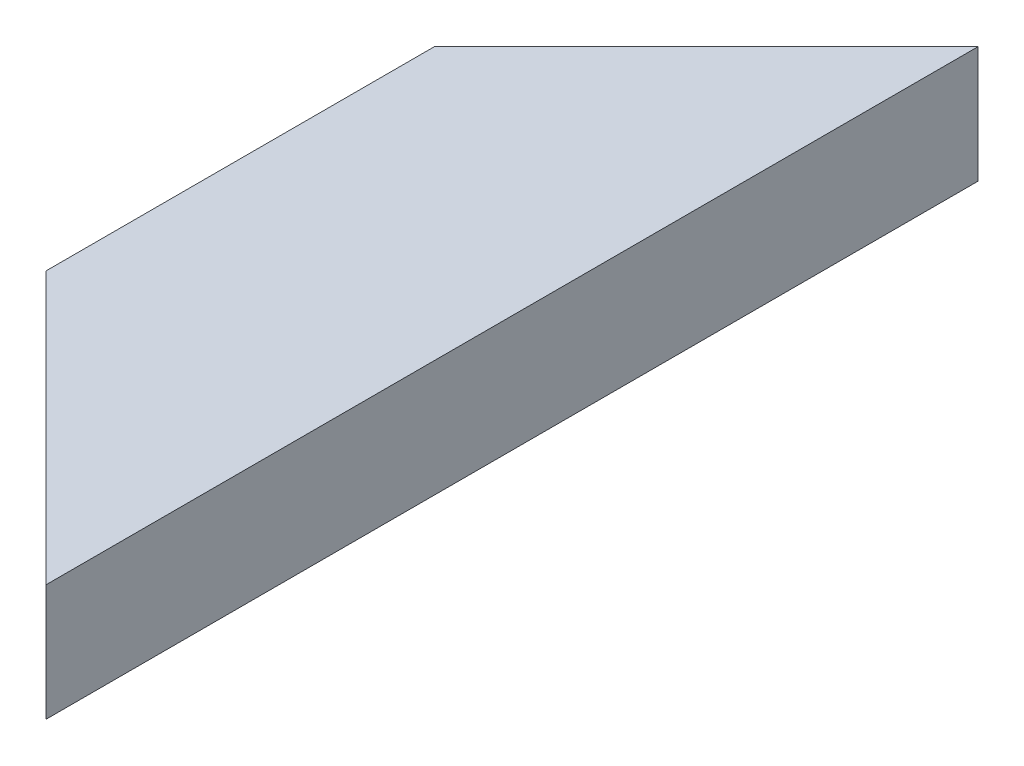
ISO-10303-21;
HEADER;
FILE_DESCRIPTION(('STEP AP214'),'2;1');
FILE_NAME('part.step','',(''),(''),'','','');
FILE_SCHEMA(('AUTOMOTIVE_DESIGN { 1 0 10303 214 1 1 1 1 }'));
ENDSEC;
DATA;
#1=APPLICATION_CONTEXT('core data for automotive mechanical design processes');
#2=APPLICATION_PROTOCOL_DEFINITION('international standard','automotive_design',2000,#1);
#3=PRODUCT_CONTEXT('',#1,'mechanical');
#4=PRODUCT('Part','Part','',(#3));
#5=PRODUCT_RELATED_PRODUCT_CATEGORY('part','',(#4));
#6=PRODUCT_DEFINITION_FORMATION('','',#4);
#7=PRODUCT_DEFINITION_CONTEXT('part definition',#1,'design');
#8=PRODUCT_DEFINITION('design','',#6,#7);
#9=PRODUCT_DEFINITION_SHAPE('','',#8);
#10=(LENGTH_UNIT() NAMED_UNIT(*) SI_UNIT(.MILLI.,.METRE.));
#11=(NAMED_UNIT(*) PLANE_ANGLE_UNIT() SI_UNIT($,.RADIAN.));
#12=(NAMED_UNIT(*) SI_UNIT($,.STERADIAN.) SOLID_ANGLE_UNIT());
#13=UNCERTAINTY_MEASURE_WITH_UNIT(LENGTH_MEASURE(1.E-05),#10,'distance_accuracy_value','');
#14=(GEOMETRIC_REPRESENTATION_CONTEXT(3) GLOBAL_UNCERTAINTY_ASSIGNED_CONTEXT((#13)) GLOBAL_UNIT_ASSIGNED_CONTEXT((#10,
#11,#12)) REPRESENTATION_CONTEXT('',''));
#15=CARTESIAN_POINT('',(0.,0.,0.));
#16=DIRECTION('',(0.,0.,1.));
#17=DIRECTION('',(1.,0.,0.));
#18=AXIS2_PLACEMENT_3D('',#15,#16,#17);
#19=CARTESIAN_POINT('',(-44.45,-19.05,304.8));
#20=DIRECTION('',(1.,0.,0.));
#21=DIRECTION('',(0.,0.,-1.));
#22=AXIS2_PLACEMENT_3D('',#19,#20,#21);
#23=PLANE('',#22);
#24=DIRECTION('',(0.,1.,0.));
#25=VECTOR('',#24,1.);
#26=CARTESIAN_POINT('',(-44.45,-19.05,215.9));
#27=LINE('',#26,#25);
#28=CARTESIAN_POINT('',(-44.45,-19.05,215.9));
#29=VERTEX_POINT('',#28);
#30=CARTESIAN_POINT('',(-44.45,19.05,215.9));
#31=VERTEX_POINT('',#30);
#32=EDGE_CURVE('E74',#29,#31,#27,.T.);
#33=ORIENTED_EDGE('',*,*,#32,.T.);
#34=DIRECTION('',(0.,0.,-1.));
#35=VECTOR('',#34,1.);
#36=CARTESIAN_POINT('',(-44.45,19.05,304.8));
#37=LINE('',#36,#35);
#38=CARTESIAN_POINT('',(-44.45,19.05,88.9));
#39=VERTEX_POINT('',#38);
#40=EDGE_CURVE('E94',#31,#39,#37,.T.);
#41=ORIENTED_EDGE('',*,*,#40,.T.);
#42=DIRECTION('',(0.,1.,0.));
#43=VECTOR('',#42,1.);
#44=CARTESIAN_POINT('',(-44.45,-19.05,88.9));
#45=LINE('',#44,#43);
#46=CARTESIAN_POINT('',(-44.45,-19.05,88.9));
#47=VERTEX_POINT('',#46);
#48=EDGE_CURVE('E93',#47,#39,#45,.T.);
#49=ORIENTED_EDGE('',*,*,#48,.F.);
#50=DIRECTION('',(0.,0.,-1.));
#51=VECTOR('',#50,1.);
#52=CARTESIAN_POINT('',(-44.45,-19.05,304.8));
#53=LINE('',#52,#51);
#54=EDGE_CURVE('E11',#29,#47,#53,.T.);
#55=ORIENTED_EDGE('',*,*,#54,.F.);
#56=EDGE_LOOP('',(#33,#41,#49,#55));
#57=FACE_BOUND('',#56,.T.);
#58=ADVANCED_FACE('F39',(#57),#23,.F.);
#59=CARTESIAN_POINT('',(44.45,-19.05,304.8));
#60=DIRECTION('',(0.,1.,0.));
#61=DIRECTION('',(-1.,0.,0.));
#62=AXIS2_PLACEMENT_3D('',#59,#60,#61);
#63=PLANE('',#62);
#64=DIRECTION('',(0.707106781186548,0.,0.707106781186548));
#65=VECTOR('',#64,1.);
#66=CARTESIAN_POINT('',(-130.175,-19.05,130.175));
#67=LINE('',#66,#65);
#68=CARTESIAN_POINT('',(44.45,-19.05,304.8));
#69=VERTEX_POINT('',#68);
#70=EDGE_CURVE('E54',#29,#69,#67,.T.);
#71=ORIENTED_EDGE('',*,*,#70,.F.);
#72=ORIENTED_EDGE('',*,*,#54,.T.);
#73=DIRECTION('',(0.707106781186547,0.,-0.707106781186548));
#74=VECTOR('',#73,1.);
#75=CARTESIAN_POINT('',(22.225,-19.05,22.225));
#76=LINE('',#75,#74);
#77=CARTESIAN_POINT('',(44.45,-19.05,1.11022302462516E-13));
#78=VERTEX_POINT('',#77);
#79=EDGE_CURVE('E98',#47,#78,#76,.T.);
#80=ORIENTED_EDGE('',*,*,#79,.T.);
#81=DIRECTION('',(0.,0.,-1.));
#82=VECTOR('',#81,1.);
#83=CARTESIAN_POINT('',(44.45,-19.05,304.8));
#84=LINE('',#83,#82);
#85=EDGE_CURVE('E48',#69,#78,#84,.T.);
#86=ORIENTED_EDGE('',*,*,#85,.F.);
#87=EDGE_LOOP('',(#71,#72,#80,#86));
#88=FACE_BOUND('',#87,.T.);
#89=ADVANCED_FACE('F86',(#88),#63,.F.);
#90=CARTESIAN_POINT('',(44.45,19.05,304.8));
#91=DIRECTION('',(0.,-1.,0.));
#92=DIRECTION('',(1.,0.,0.));
#93=AXIS2_PLACEMENT_3D('',#90,#91,#92);
#94=PLANE('',#93);
#95=DIRECTION('',(0.707106781186548,0.,0.707106781186548));
#96=VECTOR('',#95,1.);
#97=CARTESIAN_POINT('',(-130.175,19.05,130.175));
#98=LINE('',#97,#96);
#99=CARTESIAN_POINT('',(44.45,19.05,304.8));
#100=VERTEX_POINT('',#99);
#101=EDGE_CURVE('E77',#31,#100,#98,.T.);
#102=ORIENTED_EDGE('',*,*,#101,.T.);
#103=DIRECTION('',(0.,0.,-1.));
#104=VECTOR('',#103,1.);
#105=CARTESIAN_POINT('',(44.45,19.05,304.8));
#106=LINE('',#105,#104);
#107=CARTESIAN_POINT('',(44.45,19.05,0.));
#108=VERTEX_POINT('',#107);
#109=EDGE_CURVE('E115',#100,#108,#106,.T.);
#110=ORIENTED_EDGE('',*,*,#109,.T.);
#111=DIRECTION('',(0.707106781186547,0.,-0.707106781186548));
#112=VECTOR('',#111,1.);
#113=CARTESIAN_POINT('',(22.225,19.05,22.225));
#114=LINE('',#113,#112);
#115=EDGE_CURVE('E103',#39,#108,#114,.T.);
#116=ORIENTED_EDGE('',*,*,#115,.F.);
#117=ORIENTED_EDGE('',*,*,#40,.F.);
#118=EDGE_LOOP('',(#102,#110,#116,#117));
#119=FACE_BOUND('',#118,.T.);
#120=ADVANCED_FACE('F123',(#119),#94,.F.);
#121=CARTESIAN_POINT('',(44.45,-19.05,304.8));
#122=DIRECTION('',(-1.,0.,0.));
#123=DIRECTION('',(0.,0.,1.));
#124=AXIS2_PLACEMENT_3D('',#121,#122,#123);
#125=PLANE('',#124);
#126=DIRECTION('',(0.,1.,0.));
#127=VECTOR('',#126,1.);
#128=CARTESIAN_POINT('',(44.45,-19.05,0.));
#129=LINE('',#128,#127);
#130=EDGE_CURVE('E83',#78,#108,#129,.T.);
#131=ORIENTED_EDGE('',*,*,#130,.T.);
#132=ORIENTED_EDGE('',*,*,#109,.F.);
#133=DIRECTION('',(0.,1.,0.));
#134=VECTOR('',#133,1.);
#135=CARTESIAN_POINT('',(44.45,-19.05,304.8));
#136=LINE('',#135,#134);
#137=EDGE_CURVE('E107',#69,#100,#136,.T.);
#138=ORIENTED_EDGE('',*,*,#137,.F.);
#139=ORIENTED_EDGE('',*,*,#85,.T.);
#140=EDGE_LOOP('',(#131,#132,#138,#139));
#141=FACE_BOUND('',#140,.T.);
#142=ADVANCED_FACE('F120',(#141),#125,.F.);
#143=CARTESIAN_POINT('',(22.225,-19.05,22.225));
#144=DIRECTION('',(0.707106781186548,0.,0.707106781186547));
#145=DIRECTION('',(0.707106781186547,0.,-0.707106781186548));
#146=AXIS2_PLACEMENT_3D('',#143,#144,#145);
#147=PLANE('',#146);
#148=ORIENTED_EDGE('',*,*,#115,.T.);
#149=ORIENTED_EDGE('',*,*,#130,.F.);
#150=ORIENTED_EDGE('',*,*,#79,.F.);
#151=ORIENTED_EDGE('',*,*,#48,.T.);
#152=EDGE_LOOP('',(#148,#149,#150,#151));
#153=FACE_BOUND('',#152,.T.);
#154=ADVANCED_FACE('F125',(#153),#147,.F.);
#155=CARTESIAN_POINT('',(-130.175,-19.05,130.175));
#156=DIRECTION('',(-0.707106781186547,0.,0.707106781186547));
#157=DIRECTION('',(0.707106781186548,0.,0.707106781186548));
#158=AXIS2_PLACEMENT_3D('',#155,#156,#157);
#159=PLANE('',#158);
#160=ORIENTED_EDGE('',*,*,#101,.F.);
#161=ORIENTED_EDGE('',*,*,#32,.F.);
#162=ORIENTED_EDGE('',*,*,#70,.T.);
#163=ORIENTED_EDGE('',*,*,#137,.T.);
#164=EDGE_LOOP('',(#160,#161,#162,#163));
#165=FACE_BOUND('',#164,.T.);
#166=ADVANCED_FACE('F75',(#165),#159,.T.);
#167=CLOSED_SHELL('',(#58,#89,#120,#142,#154,#166));
#168=MANIFOLD_SOLID_BREP('B2',#167);
#169=ADVANCED_BREP_SHAPE_REPRESENTATION('',(#18,#168),#14);
#170=SHAPE_DEFINITION_REPRESENTATION(#9,#169);
ENDSEC;
END-ISO-10303-21;
